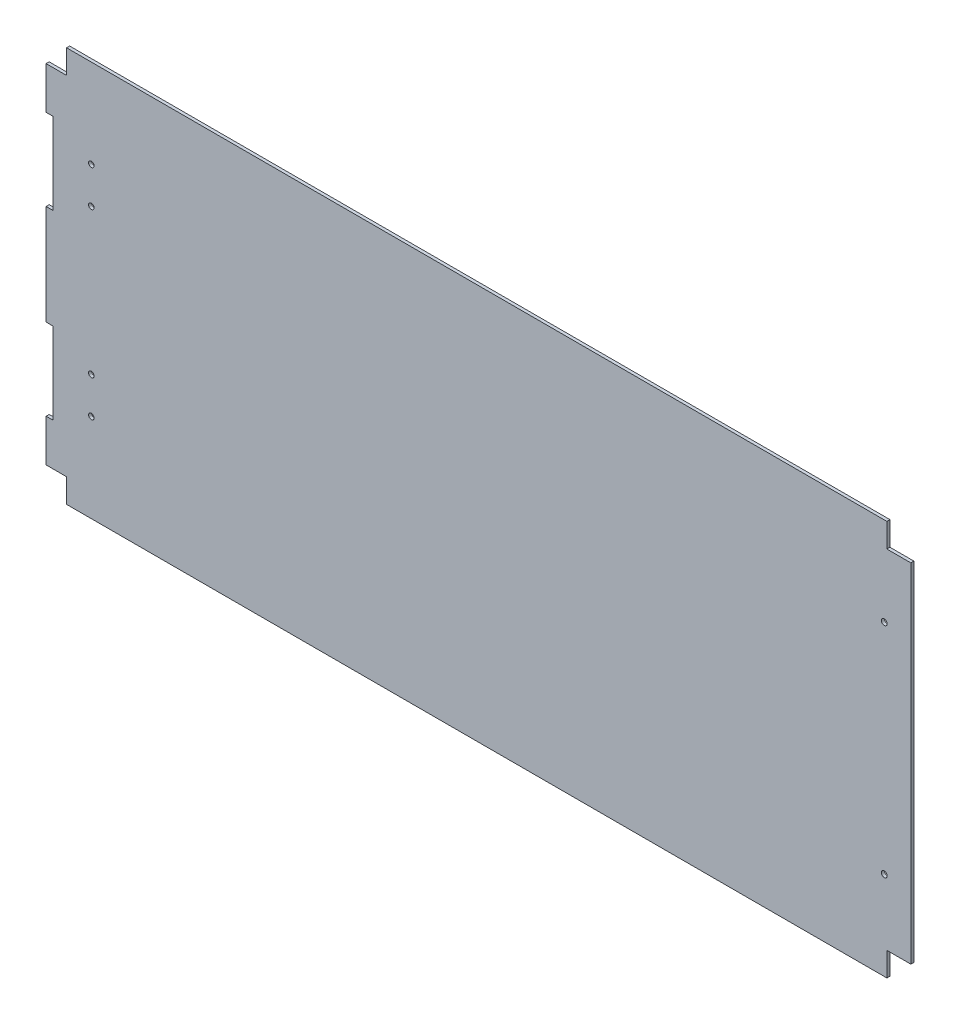
ISO-10303-21;
HEADER;
FILE_DESCRIPTION(('STEP AP214'),'2;1');
FILE_NAME('part.step','',(''),(''),'','','');
FILE_SCHEMA(('AUTOMOTIVE_DESIGN { 1 0 10303 214 1 1 1 1 }'));
ENDSEC;
DATA;
#1=APPLICATION_CONTEXT('core data for automotive mechanical design processes');
#2=APPLICATION_PROTOCOL_DEFINITION('international standard','automotive_design',2000,#1);
#3=PRODUCT_CONTEXT('',#1,'mechanical');
#4=PRODUCT('Part','Part','',(#3));
#5=PRODUCT_RELATED_PRODUCT_CATEGORY('part','',(#4));
#6=PRODUCT_DEFINITION_FORMATION('','',#4);
#7=PRODUCT_DEFINITION_CONTEXT('part definition',#1,'design');
#8=PRODUCT_DEFINITION('design','',#6,#7);
#9=PRODUCT_DEFINITION_SHAPE('','',#8);
#10=(LENGTH_UNIT() NAMED_UNIT(*) SI_UNIT(.MILLI.,.METRE.));
#11=(NAMED_UNIT(*) PLANE_ANGLE_UNIT() SI_UNIT($,.RADIAN.));
#12=(NAMED_UNIT(*) SI_UNIT($,.STERADIAN.) SOLID_ANGLE_UNIT());
#13=UNCERTAINTY_MEASURE_WITH_UNIT(LENGTH_MEASURE(1.E-05),#10,'distance_accuracy_value','');
#14=(GEOMETRIC_REPRESENTATION_CONTEXT(3) GLOBAL_UNCERTAINTY_ASSIGNED_CONTEXT((#13)) GLOBAL_UNIT_ASSIGNED_CONTEXT((#10,
#11,#12)) REPRESENTATION_CONTEXT('',''));
#15=CARTESIAN_POINT('',(0.,0.,0.));
#16=DIRECTION('',(0.,0.,1.));
#17=DIRECTION('',(1.,0.,0.));
#18=AXIS2_PLACEMENT_3D('',#15,#16,#17);
#19=CARTESIAN_POINT('',(0.,0.,-2.667));
#20=DIRECTION('',(0.,0.,-1.));
#21=DIRECTION('',(-1.,0.,0.));
#22=AXIS2_PLACEMENT_3D('',#19,#20,#21);
#23=PLANE('',#22);
#24=CARTESIAN_POINT('',(357.251,95.2500000000001,-2.667));
#25=DIRECTION('',(0.,0.,-1.));
#26=DIRECTION('',(-1.,0.,0.));
#27=AXIS2_PLACEMENT_3D('',#24,#25,#26);
#28=CIRCLE('',#27,2.54000000000001);
#29=CARTESIAN_POINT('',(354.711,95.2500000000001,-2.667));
#30=VERTEX_POINT('',#29);
#31=EDGE_CURVE('E417',#30,#30,#28,.T.);
#32=ORIENTED_EDGE('',*,*,#31,.F.);
#33=EDGE_LOOP('',(#32));
#34=FACE_BOUND('',#33,.T.);
#35=CARTESIAN_POINT('',(-334.645,-95.25,-2.667));
#36=DIRECTION('',(0.,0.,-1.));
#37=DIRECTION('',(-1.,0.,0.));
#38=AXIS2_PLACEMENT_3D('',#35,#36,#37);
#39=CIRCLE('',#38,2.41299999999999);
#40=CARTESIAN_POINT('',(-337.058,-95.25,-2.667));
#41=VERTEX_POINT('',#40);
#42=EDGE_CURVE('E414',#41,#41,#39,.T.);
#43=ORIENTED_EDGE('',*,*,#42,.F.);
#44=EDGE_LOOP('',(#43));
#45=FACE_BOUND('',#44,.T.);
#46=CARTESIAN_POINT('',(-334.645,-63.5,-2.667));
#47=DIRECTION('',(0.,0.,-1.));
#48=DIRECTION('',(-1.,0.,0.));
#49=AXIS2_PLACEMENT_3D('',#46,#47,#48);
#50=CIRCLE('',#49,2.41299999999999);
#51=CARTESIAN_POINT('',(-337.058,-63.5,-2.667));
#52=VERTEX_POINT('',#51);
#53=EDGE_CURVE('E411',#52,#52,#50,.T.);
#54=ORIENTED_EDGE('',*,*,#53,.F.);
#55=EDGE_LOOP('',(#54));
#56=FACE_BOUND('',#55,.T.);
#57=CARTESIAN_POINT('',(-334.645,63.5000000000001,-2.667));
#58=DIRECTION('',(0.,0.,-1.));
#59=DIRECTION('',(-1.,0.,0.));
#60=AXIS2_PLACEMENT_3D('',#57,#58,#59);
#61=CIRCLE('',#60,2.41299999999999);
#62=CARTESIAN_POINT('',(-337.058,63.5000000000001,-2.667));
#63=VERTEX_POINT('',#62);
#64=EDGE_CURVE('E408',#63,#63,#61,.T.);
#65=ORIENTED_EDGE('',*,*,#64,.F.);
#66=EDGE_LOOP('',(#65));
#67=FACE_BOUND('',#66,.T.);
#68=CARTESIAN_POINT('',(357.251,-95.25,-2.667));
#69=DIRECTION('',(0.,0.,-1.));
#70=DIRECTION('',(-1.,0.,0.));
#71=AXIS2_PLACEMENT_3D('',#68,#69,#70);
#72=CIRCLE('',#71,2.54000000000001);
#73=CARTESIAN_POINT('',(354.711,-95.25,-2.667));
#74=VERTEX_POINT('',#73);
#75=EDGE_CURVE('E405',#74,#74,#72,.T.);
#76=ORIENTED_EDGE('',*,*,#75,.F.);
#77=EDGE_LOOP('',(#76));
#78=FACE_BOUND('',#77,.T.);
#79=CARTESIAN_POINT('',(-334.645,95.2500000000001,-2.667));
#80=DIRECTION('',(0.,0.,-1.));
#81=DIRECTION('',(-1.,0.,0.));
#82=AXIS2_PLACEMENT_3D('',#79,#80,#81);
#83=CIRCLE('',#82,2.41299999999999);
#84=CARTESIAN_POINT('',(-337.058,95.2500000000001,-2.667));
#85=VERTEX_POINT('',#84);
#86=EDGE_CURVE('E402',#85,#85,#83,.T.);
#87=ORIENTED_EDGE('',*,*,#86,.F.);
#88=EDGE_LOOP('',(#87));
#89=FACE_BOUND('',#88,.T.);
#90=DIRECTION('',(-1.,0.,0.));
#91=VECTOR('',#90,1.);
#92=CARTESIAN_POINT('',(-365.887,-151.638,-2.667));
#93=LINE('',#92,#91);
#94=CARTESIAN_POINT('',(-356.235,-151.638,-2.667));
#95=VERTEX_POINT('',#94);
#96=CARTESIAN_POINT('',(-374.077291291236,-151.638,-2.66699999999992));
#97=VERTEX_POINT('',#96);
#98=EDGE_CURVE('E437',#95,#97,#93,.T.);
#99=ORIENTED_EDGE('',*,*,#98,.T.);
#100=DIRECTION('',(0.,-1.,0.));
#101=VECTOR('',#100,1.);
#102=CARTESIAN_POINT('',(-374.077291291236,0.,-2.66699999999992));
#103=LINE('',#102,#101);
#104=CARTESIAN_POINT('',(-374.077291291236,-114.808,-2.66699999999992));
#105=VERTEX_POINT('',#104);
#106=EDGE_CURVE('E323',#97,#105,#103,.F.);
#107=ORIENTED_EDGE('',*,*,#106,.T.);
#108=DIRECTION('',(-1.,0.,0.));
#109=VECTOR('',#108,1.);
#110=CARTESIAN_POINT('',(-374.077291291236,-114.808,-2.66699999999992));
#111=LINE('',#110,#109);
#112=CARTESIAN_POINT('',(-368.235291291236,-114.808,-2.66700000000009));
#113=VERTEX_POINT('',#112);
#114=EDGE_CURVE('E369',#113,#105,#111,.T.);
#115=ORIENTED_EDGE('',*,*,#114,.F.);
#116=DIRECTION('',(0.,-1.,0.));
#117=VECTOR('',#116,1.);
#118=CARTESIAN_POINT('',(-368.235291291236,-114.808,-2.66700000000009));
#119=LINE('',#118,#117);
#120=CARTESIAN_POINT('',(-368.235291291236,-43.688,-2.66700000000009));
#121=VERTEX_POINT('',#120);
#122=EDGE_CURVE('E376',#121,#113,#119,.T.);
#123=ORIENTED_EDGE('',*,*,#122,.F.);
#124=DIRECTION('',(1.,0.,0.));
#125=VECTOR('',#124,1.);
#126=CARTESIAN_POINT('',(-374.077291291236,-43.688,-2.66699999999992));
#127=LINE('',#126,#125);
#128=CARTESIAN_POINT('',(-374.077291291236,-43.688,-2.66699999999992));
#129=VERTEX_POINT('',#128);
#130=EDGE_CURVE('E310',#129,#121,#127,.T.);
#131=ORIENTED_EDGE('',*,*,#130,.F.);
#132=CARTESIAN_POINT('',(-374.077291291236,43.6880000000001,-2.66699999999992));
#133=VERTEX_POINT('',#132);
#134=EDGE_CURVE('E327',#129,#133,#103,.F.);
#135=ORIENTED_EDGE('',*,*,#134,.T.);
#136=DIRECTION('',(-1.,0.,0.));
#137=VECTOR('',#136,1.);
#138=CARTESIAN_POINT('',(-374.077291291236,43.6880000000001,-2.66699999999992));
#139=LINE('',#138,#137);
#140=CARTESIAN_POINT('',(-368.235291291236,43.6880000000001,-2.66700000000009));
#141=VERTEX_POINT('',#140);
#142=EDGE_CURVE('E343',#141,#133,#139,.T.);
#143=ORIENTED_EDGE('',*,*,#142,.F.);
#144=DIRECTION('',(0.,-1.,0.));
#145=VECTOR('',#144,1.);
#146=CARTESIAN_POINT('',(-368.235291291236,114.808,-2.66700000000009));
#147=LINE('',#146,#145);
#148=CARTESIAN_POINT('',(-368.235291291236,114.808,-2.66700000000009));
#149=VERTEX_POINT('',#148);
#150=EDGE_CURVE('E350',#149,#141,#147,.T.);
#151=ORIENTED_EDGE('',*,*,#150,.F.);
#152=DIRECTION('',(1.,0.,0.));
#153=VECTOR('',#152,1.);
#154=CARTESIAN_POINT('',(-374.077291291236,114.808,-2.66699999999992));
#155=LINE('',#154,#153);
#156=CARTESIAN_POINT('',(-374.077291291236,114.808,-2.66699999999992));
#157=VERTEX_POINT('',#156);
#158=EDGE_CURVE('E357',#157,#149,#155,.T.);
#159=ORIENTED_EDGE('',*,*,#158,.F.);
#160=CARTESIAN_POINT('',(-374.077291291236,151.638,-2.66699999999992));
#161=VERTEX_POINT('',#160);
#162=EDGE_CURVE('E326',#157,#161,#103,.F.);
#163=ORIENTED_EDGE('',*,*,#162,.T.);
#164=DIRECTION('',(1.,0.,0.));
#165=VECTOR('',#164,1.);
#166=CARTESIAN_POINT('',(-365.887,151.638,-2.667));
#167=LINE('',#166,#165);
#168=CARTESIAN_POINT('',(-356.235,151.638,-2.667));
#169=VERTEX_POINT('',#168);
#170=EDGE_CURVE('E13',#161,#169,#167,.T.);
#171=ORIENTED_EDGE('',*,*,#170,.T.);
#172=DIRECTION('',(0.,1.,0.));
#173=VECTOR('',#172,1.);
#174=CARTESIAN_POINT('',(-356.235,157.988,-2.667));
#175=LINE('',#174,#173);
#176=CARTESIAN_POINT('',(-356.235,172.528291291236,-2.66699999999995));
#177=VERTEX_POINT('',#176);
#178=EDGE_CURVE('E280',#169,#177,#175,.T.);
#179=ORIENTED_EDGE('',*,*,#178,.T.);
#180=DIRECTION('',(1.,0.,0.));
#181=VECTOR('',#180,1.);
#182=CARTESIAN_POINT('',(-356.235,172.528291291236,-2.66699999999995));
#183=LINE('',#182,#181);
#184=CARTESIAN_POINT('',(359.537,172.528291291236,-2.66699999999995));
#185=VERTEX_POINT('',#184);
#186=EDGE_CURVE('E279',#185,#177,#183,.F.);
#187=ORIENTED_EDGE('',*,*,#186,.F.);
#188=DIRECTION('',(0.,-1.,0.));
#189=VECTOR('',#188,1.);
#190=CARTESIAN_POINT('',(359.537,157.988,-2.667));
#191=LINE('',#190,#189);
#192=CARTESIAN_POINT('',(359.537,151.638,-2.667));
#193=VERTEX_POINT('',#192);
#194=EDGE_CURVE('E267',#185,#193,#191,.T.);
#195=ORIENTED_EDGE('',*,*,#194,.T.);
#196=DIRECTION('',(1.,0.,0.));
#197=VECTOR('',#196,1.);
#198=CARTESIAN_POINT('',(365.887,151.638,-2.667));
#199=LINE('',#198,#197);
#200=CARTESIAN_POINT('',(380.427291291236,151.638,-2.66699999999986));
#201=VERTEX_POINT('',#200);
#202=EDGE_CURVE('E276',#193,#201,#199,.T.);
#203=ORIENTED_EDGE('',*,*,#202,.T.);
#204=DIRECTION('',(0.,-1.,0.));
#205=VECTOR('',#204,1.);
#206=CARTESIAN_POINT('',(380.427291291236,151.638,-2.66699999999986));
#207=LINE('',#206,#205);
#208=CARTESIAN_POINT('',(380.427291291236,-151.638,-2.66699999999986));
#209=VERTEX_POINT('',#208);
#210=EDGE_CURVE('E304',#209,#201,#207,.F.);
#211=ORIENTED_EDGE('',*,*,#210,.F.);
#212=DIRECTION('',(-1.,0.,0.));
#213=VECTOR('',#212,1.);
#214=CARTESIAN_POINT('',(365.887,-151.638,-2.667));
#215=LINE('',#214,#213);
#216=CARTESIAN_POINT('',(359.537,-151.638,-2.667));
#217=VERTEX_POINT('',#216);
#218=EDGE_CURVE('E420',#209,#217,#215,.T.);
#219=ORIENTED_EDGE('',*,*,#218,.T.);
#220=DIRECTION('',(0.,-1.,0.));
#221=VECTOR('',#220,1.);
#222=CARTESIAN_POINT('',(359.537,-157.988,-2.667));
#223=LINE('',#222,#221);
#224=CARTESIAN_POINT('',(359.537,-172.528291291236,-2.66699999999995));
#225=VERTEX_POINT('',#224);
#226=EDGE_CURVE('E429',#217,#225,#223,.T.);
#227=ORIENTED_EDGE('',*,*,#226,.T.);
#228=DIRECTION('',(-1.,0.,0.));
#229=VECTOR('',#228,1.);
#230=CARTESIAN_POINT('',(359.537,-172.528291291236,-2.66699999999995));
#231=LINE('',#230,#229);
#232=CARTESIAN_POINT('',(-356.235,-172.528291291236,-2.66700000000006));
#233=VERTEX_POINT('',#232);
#234=EDGE_CURVE('E297',#233,#225,#231,.F.);
#235=ORIENTED_EDGE('',*,*,#234,.F.);
#236=DIRECTION('',(0.,1.,0.));
#237=VECTOR('',#236,1.);
#238=CARTESIAN_POINT('',(-356.235,-157.988,-2.667));
#239=LINE('',#238,#237);
#240=EDGE_CURVE('E439',#233,#95,#239,.T.);
#241=ORIENTED_EDGE('',*,*,#240,.T.);
#242=EDGE_LOOP('',(#99,#107,#115,#123,#131,#135,#143,#151,#159,#163,#171,#179,#187,#195,#203,
#211,#219,#227,#235,#241));
#243=FACE_BOUND('',#242,.T.);
#244=ADVANCED_FACE('F131',(#34,#45,#56,#67,#78,#89,#243),#23,.T.);
#245=CARTESIAN_POINT('',(0.,0.,0.));
#246=DIRECTION('',(0.,0.,-1.));
#247=DIRECTION('',(-1.,0.,0.));
#248=AXIS2_PLACEMENT_3D('',#245,#246,#247);
#249=PLANE('',#248);
#250=CARTESIAN_POINT('',(357.251,95.2500000000001,0.));
#251=DIRECTION('',(0.,0.,1.));
#252=DIRECTION('',(1.,0.,0.));
#253=AXIS2_PLACEMENT_3D('',#250,#251,#252);
#254=CIRCLE('',#253,2.54000000000001);
#255=CARTESIAN_POINT('',(359.791,95.2500000000001,0.));
#256=VERTEX_POINT('',#255);
#257=EDGE_CURVE('E387',#256,#256,#254,.T.);
#258=ORIENTED_EDGE('',*,*,#257,.F.);
#259=EDGE_LOOP('',(#258));
#260=FACE_BOUND('',#259,.T.);
#261=CARTESIAN_POINT('',(-334.645,-95.25,0.));
#262=DIRECTION('',(0.,0.,1.));
#263=DIRECTION('',(1.,0.,0.));
#264=AXIS2_PLACEMENT_3D('',#261,#262,#263);
#265=CIRCLE('',#264,2.41299999999999);
#266=CARTESIAN_POINT('',(-332.232,-95.25,0.));
#267=VERTEX_POINT('',#266);
#268=EDGE_CURVE('E388',#267,#267,#265,.T.);
#269=ORIENTED_EDGE('',*,*,#268,.F.);
#270=EDGE_LOOP('',(#269));
#271=FACE_BOUND('',#270,.T.);
#272=CARTESIAN_POINT('',(-334.645,-63.5,0.));
#273=DIRECTION('',(0.,0.,1.));
#274=DIRECTION('',(1.,0.,0.));
#275=AXIS2_PLACEMENT_3D('',#272,#273,#274);
#276=CIRCLE('',#275,2.41299999999999);
#277=CARTESIAN_POINT('',(-332.232,-63.5,0.));
#278=VERTEX_POINT('',#277);
#279=EDGE_CURVE('E391',#278,#278,#276,.T.);
#280=ORIENTED_EDGE('',*,*,#279,.F.);
#281=EDGE_LOOP('',(#280));
#282=FACE_BOUND('',#281,.T.);
#283=CARTESIAN_POINT('',(-334.645,63.5000000000001,0.));
#284=DIRECTION('',(0.,0.,1.));
#285=DIRECTION('',(1.,0.,0.));
#286=AXIS2_PLACEMENT_3D('',#283,#284,#285);
#287=CIRCLE('',#286,2.41299999999999);
#288=CARTESIAN_POINT('',(-332.232,63.5000000000001,0.));
#289=VERTEX_POINT('',#288);
#290=EDGE_CURVE('E394',#289,#289,#287,.T.);
#291=ORIENTED_EDGE('',*,*,#290,.F.);
#292=EDGE_LOOP('',(#291));
#293=FACE_BOUND('',#292,.T.);
#294=CARTESIAN_POINT('',(357.251,-95.25,0.));
#295=DIRECTION('',(0.,0.,1.));
#296=DIRECTION('',(1.,0.,0.));
#297=AXIS2_PLACEMENT_3D('',#294,#295,#296);
#298=CIRCLE('',#297,2.54000000000001);
#299=CARTESIAN_POINT('',(359.791,-95.25,0.));
#300=VERTEX_POINT('',#299);
#301=EDGE_CURVE('E322',#300,#300,#298,.T.);
#302=ORIENTED_EDGE('',*,*,#301,.F.);
#303=EDGE_LOOP('',(#302));
#304=FACE_BOUND('',#303,.T.);
#305=CARTESIAN_POINT('',(-334.645,95.2500000000001,0.));
#306=DIRECTION('',(0.,0.,1.));
#307=DIRECTION('',(1.,0.,0.));
#308=AXIS2_PLACEMENT_3D('',#305,#306,#307);
#309=CIRCLE('',#308,2.41299999999999);
#310=CARTESIAN_POINT('',(-332.232,95.2500000000001,0.));
#311=VERTEX_POINT('',#310);
#312=EDGE_CURVE('E397',#311,#311,#309,.T.);
#313=ORIENTED_EDGE('',*,*,#312,.F.);
#314=EDGE_LOOP('',(#313));
#315=FACE_BOUND('',#314,.T.);
#316=DIRECTION('',(1.,0.,0.));
#317=VECTOR('',#316,1.);
#318=CARTESIAN_POINT('',(-365.887,151.638,0.));
#319=LINE('',#318,#317);
#320=CARTESIAN_POINT('',(-374.077291291236,151.638,0.));
#321=VERTEX_POINT('',#320);
#322=CARTESIAN_POINT('',(-356.235,151.638,0.));
#323=VERTEX_POINT('',#322);
#324=EDGE_CURVE('E152',#321,#323,#319,.T.);
#325=ORIENTED_EDGE('',*,*,#324,.F.);
#326=DIRECTION('',(0.,1.,0.));
#327=VECTOR('',#326,1.);
#328=CARTESIAN_POINT('',(-374.077291291236,151.638,0.));
#329=LINE('',#328,#327);
#330=CARTESIAN_POINT('',(-374.077291291236,114.808,0.));
#331=VERTEX_POINT('',#330);
#332=EDGE_CURVE('E333',#331,#321,#329,.T.);
#333=ORIENTED_EDGE('',*,*,#332,.F.);
#334=DIRECTION('',(-1.,0.,0.));
#335=VECTOR('',#334,1.);
#336=CARTESIAN_POINT('',(-374.077291291236,114.808,0.));
#337=LINE('',#336,#335);
#338=CARTESIAN_POINT('',(-368.235291291236,114.808,0.));
#339=VERTEX_POINT('',#338);
#340=EDGE_CURVE('E353',#339,#331,#337,.T.);
#341=ORIENTED_EDGE('',*,*,#340,.F.);
#342=DIRECTION('',(0.,1.,0.));
#343=VECTOR('',#342,1.);
#344=CARTESIAN_POINT('',(-368.235291291236,114.808,0.));
#345=LINE('',#344,#343);
#346=CARTESIAN_POINT('',(-368.235291291236,43.6880000000001,0.));
#347=VERTEX_POINT('',#346);
#348=EDGE_CURVE('E345',#347,#339,#345,.T.);
#349=ORIENTED_EDGE('',*,*,#348,.F.);
#350=DIRECTION('',(1.,0.,0.));
#351=VECTOR('',#350,1.);
#352=CARTESIAN_POINT('',(-374.077291291236,43.6880000000001,0.));
#353=LINE('',#352,#351);
#354=CARTESIAN_POINT('',(-374.077291291236,43.6880000000001,0.));
#355=VERTEX_POINT('',#354);
#356=EDGE_CURVE('E338',#355,#347,#353,.T.);
#357=ORIENTED_EDGE('',*,*,#356,.F.);
#358=CARTESIAN_POINT('',(-374.077291291236,-43.688,0.));
#359=VERTEX_POINT('',#358);
#360=EDGE_CURVE('E334',#359,#355,#329,.T.);
#361=ORIENTED_EDGE('',*,*,#360,.F.);
#362=DIRECTION('',(-1.,0.,0.));
#363=VECTOR('',#362,1.);
#364=CARTESIAN_POINT('',(-374.077291291236,-43.688,0.));
#365=LINE('',#364,#363);
#366=CARTESIAN_POINT('',(-368.235291291236,-43.688,0.));
#367=VERTEX_POINT('',#366);
#368=EDGE_CURVE('E379',#367,#359,#365,.T.);
#369=ORIENTED_EDGE('',*,*,#368,.F.);
#370=DIRECTION('',(0.,1.,0.));
#371=VECTOR('',#370,1.);
#372=CARTESIAN_POINT('',(-368.235291291236,-114.808,0.));
#373=LINE('',#372,#371);
#374=CARTESIAN_POINT('',(-368.235291291236,-114.808,0.));
#375=VERTEX_POINT('',#374);
#376=EDGE_CURVE('E371',#375,#367,#373,.T.);
#377=ORIENTED_EDGE('',*,*,#376,.F.);
#378=DIRECTION('',(1.,0.,0.));
#379=VECTOR('',#378,1.);
#380=CARTESIAN_POINT('',(-374.077291291236,-114.808,0.));
#381=LINE('',#380,#379);
#382=CARTESIAN_POINT('',(-374.077291291236,-114.808,0.));
#383=VERTEX_POINT('',#382);
#384=EDGE_CURVE('E332',#383,#375,#381,.T.);
#385=ORIENTED_EDGE('',*,*,#384,.F.);
#386=CARTESIAN_POINT('',(-374.077291291236,-151.638,0.));
#387=VERTEX_POINT('',#386);
#388=EDGE_CURVE('E328',#387,#383,#329,.T.);
#389=ORIENTED_EDGE('',*,*,#388,.F.);
#390=DIRECTION('',(-1.,0.,0.));
#391=VECTOR('',#390,1.);
#392=CARTESIAN_POINT('',(-365.887,-151.638,0.));
#393=LINE('',#392,#391);
#394=CARTESIAN_POINT('',(-356.235,-151.638,0.));
#395=VERTEX_POINT('',#394);
#396=EDGE_CURVE('E433',#395,#387,#393,.T.);
#397=ORIENTED_EDGE('',*,*,#396,.F.);
#398=DIRECTION('',(0.,1.,0.));
#399=VECTOR('',#398,1.);
#400=CARTESIAN_POINT('',(-356.235,-157.988,0.));
#401=LINE('',#400,#399);
#402=CARTESIAN_POINT('',(-356.235,-172.528291291236,0.));
#403=VERTEX_POINT('',#402);
#404=EDGE_CURVE('E435',#403,#395,#401,.T.);
#405=ORIENTED_EDGE('',*,*,#404,.F.);
#406=DIRECTION('',(1.,0.,0.));
#407=VECTOR('',#406,1.);
#408=CARTESIAN_POINT('',(0.,-172.528291291236,0.));
#409=LINE('',#408,#407);
#410=CARTESIAN_POINT('',(359.537,-172.528291291236,0.));
#411=VERTEX_POINT('',#410);
#412=EDGE_CURVE('E307',#403,#411,#409,.T.);
#413=ORIENTED_EDGE('',*,*,#412,.T.);
#414=DIRECTION('',(0.,-1.,0.));
#415=VECTOR('',#414,1.);
#416=CARTESIAN_POINT('',(359.537,-157.988,0.));
#417=LINE('',#416,#415);
#418=CARTESIAN_POINT('',(359.537,-151.638,0.));
#419=VERTEX_POINT('',#418);
#420=EDGE_CURVE('E425',#419,#411,#417,.T.);
#421=ORIENTED_EDGE('',*,*,#420,.F.);
#422=DIRECTION('',(-1.,0.,0.));
#423=VECTOR('',#422,1.);
#424=CARTESIAN_POINT('',(365.887,-151.638,0.));
#425=LINE('',#424,#423);
#426=CARTESIAN_POINT('',(380.427291291236,-151.638,1.11022302462516E-13));
#427=VERTEX_POINT('',#426);
#428=EDGE_CURVE('E427',#427,#419,#425,.T.);
#429=ORIENTED_EDGE('',*,*,#428,.F.);
#430=DIRECTION('',(0.,1.,0.));
#431=VECTOR('',#430,1.);
#432=CARTESIAN_POINT('',(380.427291291236,0.,1.11022302462516E-13));
#433=LINE('',#432,#431);
#434=CARTESIAN_POINT('',(380.427291291236,151.638,1.11022302462516E-13));
#435=VERTEX_POINT('',#434);
#436=EDGE_CURVE('E294',#427,#435,#433,.T.);
#437=ORIENTED_EDGE('',*,*,#436,.T.);
#438=DIRECTION('',(1.,0.,0.));
#439=VECTOR('',#438,1.);
#440=CARTESIAN_POINT('',(365.887,151.638,0.));
#441=LINE('',#440,#439);
#442=CARTESIAN_POINT('',(359.537,151.638,0.));
#443=VERTEX_POINT('',#442);
#444=EDGE_CURVE('E442',#443,#435,#441,.T.);
#445=ORIENTED_EDGE('',*,*,#444,.F.);
#446=DIRECTION('',(0.,-1.,0.));
#447=VECTOR('',#446,1.);
#448=CARTESIAN_POINT('',(359.537,157.988,0.));
#449=LINE('',#448,#447);
#450=CARTESIAN_POINT('',(359.537,172.528291291236,0.));
#451=VERTEX_POINT('',#450);
#452=EDGE_CURVE('E444',#451,#443,#449,.T.);
#453=ORIENTED_EDGE('',*,*,#452,.F.);
#454=DIRECTION('',(-1.,0.,0.));
#455=VECTOR('',#454,1.);
#456=CARTESIAN_POINT('',(0.,172.528291291236,0.));
#457=LINE('',#456,#455);
#458=CARTESIAN_POINT('',(-356.235,172.528291291236,0.));
#459=VERTEX_POINT('',#458);
#460=EDGE_CURVE('E288',#451,#459,#457,.T.);
#461=ORIENTED_EDGE('',*,*,#460,.T.);
#462=DIRECTION('',(0.,1.,0.));
#463=VECTOR('',#462,1.);
#464=CARTESIAN_POINT('',(-356.235,157.988,0.));
#465=LINE('',#464,#463);
#466=EDGE_CURVE('E449',#323,#459,#465,.T.);
#467=ORIENTED_EDGE('',*,*,#466,.F.);
#468=EDGE_LOOP('',(#325,#333,#341,#349,#357,#361,#369,#377,#385,#389,#397,#405,#413,#421,#429,
#437,#445,#453,#461,#467));
#469=FACE_BOUND('',#468,.T.);
#470=ADVANCED_FACE('F133',(#260,#271,#282,#293,#304,#315,#469),#249,.F.);
#471=CARTESIAN_POINT('',(-365.887,151.638,-2.668));
#472=DIRECTION('',(0.,-1.,0.));
#473=DIRECTION('',(0.,0.,-1.));
#474=AXIS2_PLACEMENT_3D('',#471,#472,#473);
#475=PLANE('',#474);
#476=ORIENTED_EDGE('',*,*,#170,.F.);
#477=DIRECTION('',(0.,0.,-1.));
#478=VECTOR('',#477,1.);
#479=CARTESIAN_POINT('',(-374.077291291236,151.638,0.));
#480=LINE('',#479,#478);
#481=EDGE_CURVE('E360',#321,#161,#480,.T.);
#482=ORIENTED_EDGE('',*,*,#481,.F.);
#483=ORIENTED_EDGE('',*,*,#324,.T.);
#484=DIRECTION('',(0.,0.,1.));
#485=VECTOR('',#484,1.);
#486=CARTESIAN_POINT('',(-356.235,151.638,-2.668));
#487=LINE('',#486,#485);
#488=EDGE_CURVE('E139',#169,#323,#487,.T.);
#489=ORIENTED_EDGE('',*,*,#488,.F.);
#490=EDGE_LOOP('',(#476,#482,#483,#489));
#491=FACE_BOUND('',#490,.T.);
#492=ADVANCED_FACE('F515',(#491),#475,.F.);
#493=CARTESIAN_POINT('',(-365.887,-151.638,-2.668));
#494=DIRECTION('',(0.,1.,0.));
#495=DIRECTION('',(0.,0.,1.));
#496=AXIS2_PLACEMENT_3D('',#493,#494,#495);
#497=PLANE('',#496);
#498=ORIENTED_EDGE('',*,*,#396,.T.);
#499=DIRECTION('',(0.,0.,-1.));
#500=VECTOR('',#499,1.);
#501=CARTESIAN_POINT('',(-374.077291291236,-151.638,0.));
#502=LINE('',#501,#500);
#503=EDGE_CURVE('E319',#387,#97,#502,.T.);
#504=ORIENTED_EDGE('',*,*,#503,.T.);
#505=ORIENTED_EDGE('',*,*,#98,.F.);
#506=DIRECTION('',(0.,0.,1.));
#507=VECTOR('',#506,1.);
#508=CARTESIAN_POINT('',(-356.235,-151.638,-2.668));
#509=LINE('',#508,#507);
#510=EDGE_CURVE('E275',#95,#395,#509,.T.);
#511=ORIENTED_EDGE('',*,*,#510,.T.);
#512=EDGE_LOOP('',(#498,#504,#505,#511));
#513=FACE_BOUND('',#512,.T.);
#514=ADVANCED_FACE('F482',(#513),#497,.F.);
#515=CARTESIAN_POINT('',(359.537,-157.988,-2.668));
#516=DIRECTION('',(-1.,0.,0.));
#517=DIRECTION('',(0.,0.,1.));
#518=AXIS2_PLACEMENT_3D('',#515,#516,#517);
#519=PLANE('',#518);
#520=ORIENTED_EDGE('',*,*,#420,.T.);
#521=DIRECTION('',(0.,0.,-1.));
#522=VECTOR('',#521,1.);
#523=CARTESIAN_POINT('',(359.537,-172.528291291236,0.));
#524=LINE('',#523,#522);
#525=EDGE_CURVE('E311',#411,#225,#524,.T.);
#526=ORIENTED_EDGE('',*,*,#525,.T.);
#527=ORIENTED_EDGE('',*,*,#226,.F.);
#528=DIRECTION('',(0.,0.,1.));
#529=VECTOR('',#528,1.);
#530=CARTESIAN_POINT('',(359.537,-151.638,-2.668));
#531=LINE('',#530,#529);
#532=EDGE_CURVE('E422',#217,#419,#531,.T.);
#533=ORIENTED_EDGE('',*,*,#532,.T.);
#534=EDGE_LOOP('',(#520,#526,#527,#533));
#535=FACE_BOUND('',#534,.T.);
#536=ADVANCED_FACE('F471',(#535),#519,.F.);
#537=CARTESIAN_POINT('',(-356.235,-157.988,-2.668));
#538=DIRECTION('',(1.,0.,0.));
#539=DIRECTION('',(0.,1.,0.));
#540=AXIS2_PLACEMENT_3D('',#537,#538,#539);
#541=PLANE('',#540);
#542=ORIENTED_EDGE('',*,*,#240,.F.);
#543=DIRECTION('',(0.,0.,-1.));
#544=VECTOR('',#543,1.);
#545=CARTESIAN_POINT('',(-356.235,-172.528291291236,0.));
#546=LINE('',#545,#544);
#547=EDGE_CURVE('E314',#403,#233,#546,.T.);
#548=ORIENTED_EDGE('',*,*,#547,.F.);
#549=ORIENTED_EDGE('',*,*,#404,.T.);
#550=ORIENTED_EDGE('',*,*,#510,.F.);
#551=EDGE_LOOP('',(#542,#548,#549,#550));
#552=FACE_BOUND('',#551,.T.);
#553=ADVANCED_FACE('F486',(#552),#541,.F.);
#554=CARTESIAN_POINT('',(365.887,-151.638,-2.668));
#555=DIRECTION('',(0.,1.,0.));
#556=DIRECTION('',(0.,0.,1.));
#557=AXIS2_PLACEMENT_3D('',#554,#555,#556);
#558=PLANE('',#557);
#559=ORIENTED_EDGE('',*,*,#218,.F.);
#560=DIRECTION('',(0.,0.,-1.));
#561=VECTOR('',#560,1.);
#562=CARTESIAN_POINT('',(380.427291291236,-151.638,1.11022302462516E-13));
#563=LINE('',#562,#561);
#564=EDGE_CURVE('E301',#427,#209,#563,.T.);
#565=ORIENTED_EDGE('',*,*,#564,.F.);
#566=ORIENTED_EDGE('',*,*,#428,.T.);
#567=ORIENTED_EDGE('',*,*,#532,.F.);
#568=EDGE_LOOP('',(#559,#565,#566,#567));
#569=FACE_BOUND('',#568,.T.);
#570=ADVANCED_FACE('F466',(#569),#558,.F.);
#571=CARTESIAN_POINT('',(365.887,151.638,-2.668));
#572=DIRECTION('',(0.,-1.,0.));
#573=DIRECTION('',(0.,0.,-1.));
#574=AXIS2_PLACEMENT_3D('',#571,#572,#573);
#575=PLANE('',#574);
#576=ORIENTED_EDGE('',*,*,#444,.T.);
#577=DIRECTION('',(0.,0.,-1.));
#578=VECTOR('',#577,1.);
#579=CARTESIAN_POINT('',(380.427291291236,151.638,1.11022302462516E-13));
#580=LINE('',#579,#578);
#581=EDGE_CURVE('E298',#435,#201,#580,.T.);
#582=ORIENTED_EDGE('',*,*,#581,.T.);
#583=ORIENTED_EDGE('',*,*,#202,.F.);
#584=DIRECTION('',(0.,0.,1.));
#585=VECTOR('',#584,1.);
#586=CARTESIAN_POINT('',(359.537,151.638,-2.668));
#587=LINE('',#586,#585);
#588=EDGE_CURVE('E273',#193,#443,#587,.T.);
#589=ORIENTED_EDGE('',*,*,#588,.T.);
#590=EDGE_LOOP('',(#576,#582,#583,#589));
#591=FACE_BOUND('',#590,.T.);
#592=ADVANCED_FACE('F458',(#591),#575,.F.);
#593=CARTESIAN_POINT('',(-356.235,157.988,-2.668));
#594=DIRECTION('',(1.,0.,0.));
#595=DIRECTION('',(0.,1.,0.));
#596=AXIS2_PLACEMENT_3D('',#593,#594,#595);
#597=PLANE('',#596);
#598=ORIENTED_EDGE('',*,*,#466,.T.);
#599=DIRECTION('',(0.,0.,-1.));
#600=VECTOR('',#599,1.);
#601=CARTESIAN_POINT('',(-356.235,172.528291291236,0.));
#602=LINE('',#601,#600);
#603=EDGE_CURVE('E289',#459,#177,#602,.T.);
#604=ORIENTED_EDGE('',*,*,#603,.T.);
#605=ORIENTED_EDGE('',*,*,#178,.F.);
#606=ORIENTED_EDGE('',*,*,#488,.T.);
#607=EDGE_LOOP('',(#598,#604,#605,#606));
#608=FACE_BOUND('',#607,.T.);
#609=ADVANCED_FACE('F452',(#608),#597,.F.);
#610=CARTESIAN_POINT('',(359.537,157.988,-2.668));
#611=DIRECTION('',(-1.,0.,0.));
#612=DIRECTION('',(0.,0.,1.));
#613=AXIS2_PLACEMENT_3D('',#610,#611,#612);
#614=PLANE('',#613);
#615=ORIENTED_EDGE('',*,*,#194,.F.);
#616=DIRECTION('',(0.,0.,-1.));
#617=VECTOR('',#616,1.);
#618=CARTESIAN_POINT('',(359.537,172.528291291236,0.));
#619=LINE('',#618,#617);
#620=EDGE_CURVE('E271',#451,#185,#619,.T.);
#621=ORIENTED_EDGE('',*,*,#620,.F.);
#622=ORIENTED_EDGE('',*,*,#452,.T.);
#623=ORIENTED_EDGE('',*,*,#588,.F.);
#624=EDGE_LOOP('',(#615,#621,#622,#623));
#625=FACE_BOUND('',#624,.T.);
#626=ADVANCED_FACE('F269',(#625),#614,.F.);
#627=CARTESIAN_POINT('',(-334.645,95.2500000000001,-19.05));
#628=DIRECTION('',(0.,0.,1.));
#629=DIRECTION('',(1.,0.,0.));
#630=AXIS2_PLACEMENT_3D('',#627,#628,#629);
#631=CYLINDRICAL_SURFACE('',#630,2.41299999999999);
#632=ORIENTED_EDGE('',*,*,#86,.T.);
#633=EDGE_LOOP('',(#632));
#634=FACE_BOUND('',#633,.T.);
#635=ORIENTED_EDGE('',*,*,#312,.T.);
#636=EDGE_LOOP('',(#635));
#637=FACE_BOUND('',#636,.T.);
#638=ADVANCED_FACE('F552',(#634,#637),#631,.F.);
#639=CARTESIAN_POINT('',(357.251,-95.25,-19.05));
#640=DIRECTION('',(0.,0.,1.));
#641=DIRECTION('',(1.,0.,0.));
#642=AXIS2_PLACEMENT_3D('',#639,#640,#641);
#643=CYLINDRICAL_SURFACE('',#642,2.54000000000001);
#644=ORIENTED_EDGE('',*,*,#75,.T.);
#645=EDGE_LOOP('',(#644));
#646=FACE_BOUND('',#645,.T.);
#647=ORIENTED_EDGE('',*,*,#301,.T.);
#648=EDGE_LOOP('',(#647));
#649=FACE_BOUND('',#648,.T.);
#650=ADVANCED_FACE('F563',(#646,#649),#643,.F.);
#651=CARTESIAN_POINT('',(-334.645,63.5000000000001,-19.05));
#652=DIRECTION('',(0.,0.,1.));
#653=DIRECTION('',(1.,0.,0.));
#654=AXIS2_PLACEMENT_3D('',#651,#652,#653);
#655=CYLINDRICAL_SURFACE('',#654,2.41299999999999);
#656=ORIENTED_EDGE('',*,*,#64,.T.);
#657=EDGE_LOOP('',(#656));
#658=FACE_BOUND('',#657,.T.);
#659=ORIENTED_EDGE('',*,*,#290,.T.);
#660=EDGE_LOOP('',(#659));
#661=FACE_BOUND('',#660,.T.);
#662=ADVANCED_FACE('F569',(#658,#661),#655,.F.);
#663=CARTESIAN_POINT('',(-334.645,-63.5,-19.05));
#664=DIRECTION('',(0.,0.,1.));
#665=DIRECTION('',(1.,0.,0.));
#666=AXIS2_PLACEMENT_3D('',#663,#664,#665);
#667=CYLINDRICAL_SURFACE('',#666,2.41299999999999);
#668=ORIENTED_EDGE('',*,*,#53,.T.);
#669=EDGE_LOOP('',(#668));
#670=FACE_BOUND('',#669,.T.);
#671=ORIENTED_EDGE('',*,*,#279,.T.);
#672=EDGE_LOOP('',(#671));
#673=FACE_BOUND('',#672,.T.);
#674=ADVANCED_FACE('F565',(#670,#673),#667,.F.);
#675=CARTESIAN_POINT('',(-334.645,-95.25,-19.05));
#676=DIRECTION('',(0.,0.,1.));
#677=DIRECTION('',(1.,0.,0.));
#678=AXIS2_PLACEMENT_3D('',#675,#676,#677);
#679=CYLINDRICAL_SURFACE('',#678,2.41299999999999);
#680=ORIENTED_EDGE('',*,*,#42,.T.);
#681=EDGE_LOOP('',(#680));
#682=FACE_BOUND('',#681,.T.);
#683=ORIENTED_EDGE('',*,*,#268,.T.);
#684=EDGE_LOOP('',(#683));
#685=FACE_BOUND('',#684,.T.);
#686=ADVANCED_FACE('F568',(#682,#685),#679,.F.);
#687=CARTESIAN_POINT('',(357.251,95.2500000000001,-19.05));
#688=DIRECTION('',(0.,0.,1.));
#689=DIRECTION('',(1.,0.,0.));
#690=AXIS2_PLACEMENT_3D('',#687,#688,#689);
#691=CYLINDRICAL_SURFACE('',#690,2.54000000000001);
#692=ORIENTED_EDGE('',*,*,#31,.T.);
#693=EDGE_LOOP('',(#692));
#694=FACE_BOUND('',#693,.T.);
#695=ORIENTED_EDGE('',*,*,#257,.T.);
#696=EDGE_LOOP('',(#695));
#697=FACE_BOUND('',#696,.T.);
#698=ADVANCED_FACE('F574',(#694,#697),#691,.F.);
#699=CARTESIAN_POINT('',(-374.077291291243,-43.688,-731.775));
#700=DIRECTION('',(0.,1.,0.));
#701=DIRECTION('',(1.,0.,0.));
#702=AXIS2_PLACEMENT_3D('',#699,#700,#701);
#703=PLANE('',#702);
#704=ORIENTED_EDGE('',*,*,#130,.T.);
#705=DIRECTION('',(0.,0.,1.));
#706=VECTOR('',#705,1.);
#707=CARTESIAN_POINT('',(-368.235291291243,-43.688,-731.775));
#708=LINE('',#707,#706);
#709=EDGE_CURVE('E381',#121,#367,#708,.T.);
#710=ORIENTED_EDGE('',*,*,#709,.T.);
#711=ORIENTED_EDGE('',*,*,#368,.T.);
#712=DIRECTION('',(0.,0.,1.));
#713=VECTOR('',#712,1.);
#714=CARTESIAN_POINT('',(-374.077291291243,-43.688,-731.775));
#715=LINE('',#714,#713);
#716=EDGE_CURVE('E335',#129,#359,#715,.T.);
#717=ORIENTED_EDGE('',*,*,#716,.F.);
#718=EDGE_LOOP('',(#704,#710,#711,#717));
#719=FACE_BOUND('',#718,.T.);
#720=ADVANCED_FACE('F502',(#719),#703,.F.);
#721=CARTESIAN_POINT('',(-368.235291291243,-114.808,-731.775));
#722=DIRECTION('',(1.,0.,0.));
#723=DIRECTION('',(0.,0.,-1.));
#724=AXIS2_PLACEMENT_3D('',#721,#722,#723);
#725=PLANE('',#724);
#726=ORIENTED_EDGE('',*,*,#122,.T.);
#727=DIRECTION('',(0.,0.,1.));
#728=VECTOR('',#727,1.);
#729=CARTESIAN_POINT('',(-368.235291291243,-114.808,-731.775));
#730=LINE('',#729,#728);
#731=EDGE_CURVE('E374',#113,#375,#730,.T.);
#732=ORIENTED_EDGE('',*,*,#731,.T.);
#733=ORIENTED_EDGE('',*,*,#376,.T.);
#734=ORIENTED_EDGE('',*,*,#709,.F.);
#735=EDGE_LOOP('',(#726,#732,#733,#734));
#736=FACE_BOUND('',#735,.T.);
#737=ADVANCED_FACE('F499',(#736),#725,.F.);
#738=CARTESIAN_POINT('',(-374.077291291243,-114.808,-731.775));
#739=DIRECTION('',(0.,-1.,0.));
#740=DIRECTION('',(-1.,0.,0.));
#741=AXIS2_PLACEMENT_3D('',#738,#739,#740);
#742=PLANE('',#741);
#743=ORIENTED_EDGE('',*,*,#114,.T.);
#744=DIRECTION('',(0.,0.,1.));
#745=VECTOR('',#744,1.);
#746=CARTESIAN_POINT('',(-374.077291291243,-114.808,-731.775));
#747=LINE('',#746,#745);
#748=EDGE_CURVE('E367',#105,#383,#747,.T.);
#749=ORIENTED_EDGE('',*,*,#748,.T.);
#750=ORIENTED_EDGE('',*,*,#384,.T.);
#751=ORIENTED_EDGE('',*,*,#731,.F.);
#752=EDGE_LOOP('',(#743,#749,#750,#751));
#753=FACE_BOUND('',#752,.T.);
#754=ADVANCED_FACE('F496',(#753),#742,.F.);
#755=CARTESIAN_POINT('',(-374.077291291236,151.638,0.));
#756=DIRECTION('',(-1.,0.,0.));
#757=DIRECTION('',(0.,0.,1.));
#758=AXIS2_PLACEMENT_3D('',#755,#756,#757);
#759=PLANE('',#758);
#760=ORIENTED_EDGE('',*,*,#748,.F.);
#761=ORIENTED_EDGE('',*,*,#106,.F.);
#762=ORIENTED_EDGE('',*,*,#503,.F.);
#763=ORIENTED_EDGE('',*,*,#388,.T.);
#764=EDGE_LOOP('',(#760,#761,#762,#763));
#765=FACE_BOUND('',#764,.T.);
#766=ADVANCED_FACE('F491',(#765),#759,.T.);
#767=DIRECTION('',(0.,0.,1.));
#768=VECTOR('',#767,1.);
#769=CARTESIAN_POINT('',(-374.077291291243,114.808,-731.775));
#770=LINE('',#769,#768);
#771=EDGE_CURVE('E331',#157,#331,#770,.T.);
#772=ORIENTED_EDGE('',*,*,#771,.T.);
#773=ORIENTED_EDGE('',*,*,#332,.T.);
#774=ORIENTED_EDGE('',*,*,#481,.T.);
#775=ORIENTED_EDGE('',*,*,#162,.F.);
#776=EDGE_LOOP('',(#772,#773,#774,#775));
#777=FACE_BOUND('',#776,.T.);
#778=ADVANCED_FACE('F512',(#777),#759,.T.);
#779=CARTESIAN_POINT('',(-374.077291291243,114.808,-731.775));
#780=DIRECTION('',(0.,1.,0.));
#781=DIRECTION('',(1.,0.,0.));
#782=AXIS2_PLACEMENT_3D('',#779,#780,#781);
#783=PLANE('',#782);
#784=ORIENTED_EDGE('',*,*,#158,.T.);
#785=DIRECTION('',(0.,0.,1.));
#786=VECTOR('',#785,1.);
#787=CARTESIAN_POINT('',(-368.235291291243,114.808,-731.775));
#788=LINE('',#787,#786);
#789=EDGE_CURVE('E355',#149,#339,#788,.T.);
#790=ORIENTED_EDGE('',*,*,#789,.T.);
#791=ORIENTED_EDGE('',*,*,#340,.T.);
#792=ORIENTED_EDGE('',*,*,#771,.F.);
#793=EDGE_LOOP('',(#784,#790,#791,#792));
#794=FACE_BOUND('',#793,.T.);
#795=ADVANCED_FACE('F519',(#794),#783,.F.);
#796=CARTESIAN_POINT('',(-368.235291291243,114.808,-731.775));
#797=DIRECTION('',(1.,0.,0.));
#798=DIRECTION('',(0.,0.,-1.));
#799=AXIS2_PLACEMENT_3D('',#796,#797,#798);
#800=PLANE('',#799);
#801=ORIENTED_EDGE('',*,*,#150,.T.);
#802=DIRECTION('',(0.,0.,1.));
#803=VECTOR('',#802,1.);
#804=CARTESIAN_POINT('',(-368.235291291243,43.6880000000001,-731.775));
#805=LINE('',#804,#803);
#806=EDGE_CURVE('E348',#141,#347,#805,.T.);
#807=ORIENTED_EDGE('',*,*,#806,.T.);
#808=ORIENTED_EDGE('',*,*,#348,.T.);
#809=ORIENTED_EDGE('',*,*,#789,.F.);
#810=EDGE_LOOP('',(#801,#807,#808,#809));
#811=FACE_BOUND('',#810,.T.);
#812=ADVANCED_FACE('F523',(#811),#800,.F.);
#813=CARTESIAN_POINT('',(-374.077291291243,43.6880000000001,-731.775));
#814=DIRECTION('',(0.,-1.,0.));
#815=DIRECTION('',(-1.,0.,0.));
#816=AXIS2_PLACEMENT_3D('',#813,#814,#815);
#817=PLANE('',#816);
#818=ORIENTED_EDGE('',*,*,#142,.T.);
#819=DIRECTION('',(0.,0.,1.));
#820=VECTOR('',#819,1.);
#821=CARTESIAN_POINT('',(-374.077291291243,43.6880000000001,-731.775));
#822=LINE('',#821,#820);
#823=EDGE_CURVE('E341',#133,#355,#822,.T.);
#824=ORIENTED_EDGE('',*,*,#823,.T.);
#825=ORIENTED_EDGE('',*,*,#356,.T.);
#826=ORIENTED_EDGE('',*,*,#806,.F.);
#827=EDGE_LOOP('',(#818,#824,#825,#826));
#828=FACE_BOUND('',#827,.T.);
#829=ADVANCED_FACE('F525',(#828),#817,.F.);
#830=ORIENTED_EDGE('',*,*,#823,.F.);
#831=ORIENTED_EDGE('',*,*,#134,.F.);
#832=ORIENTED_EDGE('',*,*,#716,.T.);
#833=ORIENTED_EDGE('',*,*,#360,.T.);
#834=EDGE_LOOP('',(#830,#831,#832,#833));
#835=FACE_BOUND('',#834,.T.);
#836=ADVANCED_FACE('F508',(#835),#759,.T.);
#837=CARTESIAN_POINT('',(359.537,-172.528291291236,0.));
#838=DIRECTION('',(0.,1.,0.));
#839=DIRECTION('',(0.,0.,1.));
#840=AXIS2_PLACEMENT_3D('',#837,#838,#839);
#841=PLANE('',#840);
#842=ORIENTED_EDGE('',*,*,#234,.T.);
#843=ORIENTED_EDGE('',*,*,#525,.F.);
#844=ORIENTED_EDGE('',*,*,#412,.F.);
#845=ORIENTED_EDGE('',*,*,#547,.T.);
#846=EDGE_LOOP('',(#842,#843,#844,#845));
#847=FACE_BOUND('',#846,.T.);
#848=ADVANCED_FACE('F476',(#847),#841,.F.);
#849=CARTESIAN_POINT('',(380.427291291236,151.638,1.11022302462516E-13));
#850=DIRECTION('',(-1.,0.,0.));
#851=DIRECTION('',(0.,0.,1.));
#852=AXIS2_PLACEMENT_3D('',#849,#850,#851);
#853=PLANE('',#852);
#854=ORIENTED_EDGE('',*,*,#210,.T.);
#855=ORIENTED_EDGE('',*,*,#581,.F.);
#856=ORIENTED_EDGE('',*,*,#436,.F.);
#857=ORIENTED_EDGE('',*,*,#564,.T.);
#858=EDGE_LOOP('',(#854,#855,#856,#857));
#859=FACE_BOUND('',#858,.T.);
#860=ADVANCED_FACE('F462',(#859),#853,.F.);
#861=CARTESIAN_POINT('',(-356.235,172.528291291236,0.));
#862=DIRECTION('',(0.,-1.,0.));
#863=DIRECTION('',(0.,0.,-1.));
#864=AXIS2_PLACEMENT_3D('',#861,#862,#863);
#865=PLANE('',#864);
#866=ORIENTED_EDGE('',*,*,#186,.T.);
#867=ORIENTED_EDGE('',*,*,#603,.F.);
#868=ORIENTED_EDGE('',*,*,#460,.F.);
#869=ORIENTED_EDGE('',*,*,#620,.T.);
#870=EDGE_LOOP('',(#866,#867,#868,#869));
#871=FACE_BOUND('',#870,.T.);
#872=ADVANCED_FACE('F286',(#871),#865,.F.);
#873=CLOSED_SHELL('',(#244,#470,#492,#514,#536,#553,#570,#592,#609,#626,#638,#650,#662,#674,
#686,#698,#720,#737,#754,#766,#778,#795,#812,#829,#836,#848,#860,#872));
#874=MANIFOLD_SOLID_BREP('B2',#873);
#875=ADVANCED_BREP_SHAPE_REPRESENTATION('',(#18,#874),#14);
#876=SHAPE_DEFINITION_REPRESENTATION(#9,#875);
ENDSEC;
END-ISO-10303-21;
